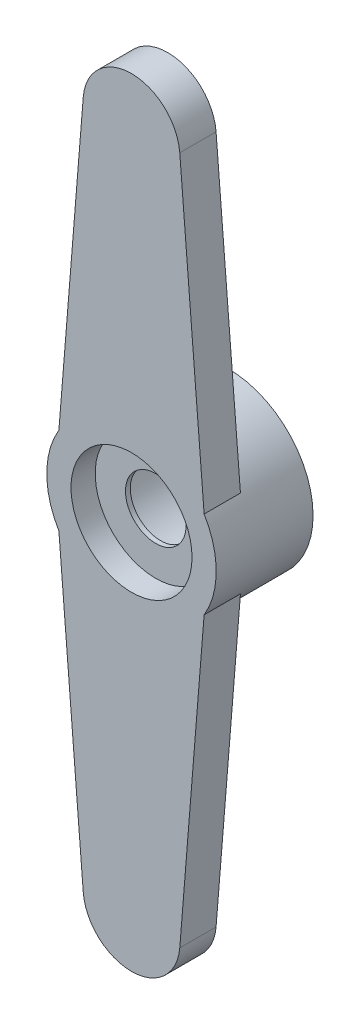
ISO-10303-21;
HEADER;
FILE_DESCRIPTION(('STEP AP214'),'2;1');
FILE_NAME('part.step','',(''),(''),'','','');
FILE_SCHEMA(('AUTOMOTIVE_DESIGN { 1 0 10303 214 1 1 1 1 }'));
ENDSEC;
DATA;
#1=APPLICATION_CONTEXT('core data for automotive mechanical design processes');
#2=APPLICATION_PROTOCOL_DEFINITION('international standard','automotive_design',2000,#1);
#3=PRODUCT_CONTEXT('',#1,'mechanical');
#4=PRODUCT('Part','Part','',(#3));
#5=PRODUCT_RELATED_PRODUCT_CATEGORY('part','',(#4));
#6=PRODUCT_DEFINITION_FORMATION('','',#4);
#7=PRODUCT_DEFINITION_CONTEXT('part definition',#1,'design');
#8=PRODUCT_DEFINITION('design','',#6,#7);
#9=PRODUCT_DEFINITION_SHAPE('','',#8);
#10=(LENGTH_UNIT() NAMED_UNIT(*) SI_UNIT(.MILLI.,.METRE.));
#11=(NAMED_UNIT(*) PLANE_ANGLE_UNIT() SI_UNIT($,.RADIAN.));
#12=(NAMED_UNIT(*) SI_UNIT($,.STERADIAN.) SOLID_ANGLE_UNIT());
#13=UNCERTAINTY_MEASURE_WITH_UNIT(LENGTH_MEASURE(1.E-05),#10,'distance_accuracy_value','');
#14=(GEOMETRIC_REPRESENTATION_CONTEXT(3) GLOBAL_UNCERTAINTY_ASSIGNED_CONTEXT((#13)) GLOBAL_UNIT_ASSIGNED_CONTEXT((#10,
#11,#12)) REPRESENTATION_CONTEXT('',''));
#15=CARTESIAN_POINT('',(0.,0.,0.));
#16=DIRECTION('',(0.,0.,1.));
#17=DIRECTION('',(1.,0.,0.));
#18=AXIS2_PLACEMENT_3D('',#15,#16,#17);
#19=CARTESIAN_POINT('',(0.,0.,2.8));
#20=DIRECTION('',(0.,0.,-1.));
#21=DIRECTION('',(-1.,0.,0.));
#22=AXIS2_PLACEMENT_3D('',#19,#20,#21);
#23=CYLINDRICAL_SURFACE('',#22,3.5);
#24=CARTESIAN_POINT('',(0.,0.,0.));
#25=DIRECTION('',(0.,0.,1.));
#26=DIRECTION('',(1.,0.,0.));
#27=AXIS2_PLACEMENT_3D('',#24,#25,#26);
#28=CIRCLE('',#27,3.5);
#29=CARTESIAN_POINT('',(3.5,0.,0.));
#30=VERTEX_POINT('',#29);
#31=EDGE_CURVE('E11',#30,#30,#28,.T.);
#32=ORIENTED_EDGE('',*,*,#31,.T.);
#33=EDGE_LOOP('',(#32));
#34=FACE_BOUND('',#33,.T.);
#35=DIRECTION('',(0.,0.,1.));
#36=VECTOR('',#35,1.);
#37=CARTESIAN_POINT('',(-3.,1.80277563773199,2.5));
#38=LINE('',#37,#36);
#39=CARTESIAN_POINT('',(-3.,1.80277563773199,2.5));
#40=VERTEX_POINT('',#39);
#41=CARTESIAN_POINT('',(-3.,1.80277563773199,4.));
#42=VERTEX_POINT('',#41);
#43=EDGE_CURVE('E54',#40,#42,#38,.T.);
#44=ORIENTED_EDGE('',*,*,#43,.F.);
#45=CARTESIAN_POINT('',(0.,0.,2.5));
#46=DIRECTION('',(0.,0.,1.));
#47=DIRECTION('',(1.,0.,0.));
#48=AXIS2_PLACEMENT_3D('',#45,#46,#47);
#49=CIRCLE('',#48,3.5);
#50=CARTESIAN_POINT('',(3.,1.80277563773199,2.5));
#51=VERTEX_POINT('',#50);
#52=EDGE_CURVE('E110',#51,#40,#49,.T.);
#53=ORIENTED_EDGE('',*,*,#52,.F.);
#54=DIRECTION('',(0.,0.,1.));
#55=VECTOR('',#54,1.);
#56=CARTESIAN_POINT('',(3.,1.80277563773199,2.5));
#57=LINE('',#56,#55);
#58=CARTESIAN_POINT('',(3.,1.80277563773199,4.));
#59=VERTEX_POINT('',#58);
#60=EDGE_CURVE('E119',#51,#59,#57,.T.);
#61=ORIENTED_EDGE('',*,*,#60,.T.);
#62=CARTESIAN_POINT('',(0.,0.,4.));
#63=DIRECTION('',(0.,0.,1.));
#64=DIRECTION('',(1.,0.,0.));
#65=AXIS2_PLACEMENT_3D('',#62,#63,#64);
#66=CIRCLE('',#65,3.5);
#67=CARTESIAN_POINT('',(3.,-1.80277563773199,4.));
#68=VERTEX_POINT('',#67);
#69=EDGE_CURVE('E200',#68,#59,#66,.T.);
#70=ORIENTED_EDGE('',*,*,#69,.F.);
#71=DIRECTION('',(0.,0.,1.));
#72=VECTOR('',#71,1.);
#73=CARTESIAN_POINT('',(3.,-1.80277563773199,2.5));
#74=LINE('',#73,#72);
#75=CARTESIAN_POINT('',(3.,-1.80277563773199,2.5));
#76=VERTEX_POINT('',#75);
#77=EDGE_CURVE('E179',#76,#68,#74,.T.);
#78=ORIENTED_EDGE('',*,*,#77,.F.);
#79=CARTESIAN_POINT('',(0.,0.,2.5));
#80=DIRECTION('',(0.,0.,-1.));
#81=DIRECTION('',(1.,0.,0.));
#82=AXIS2_PLACEMENT_3D('',#79,#80,#81);
#83=CIRCLE('',#82,3.5);
#84=CARTESIAN_POINT('',(-3.,-1.80277563773199,2.5));
#85=VERTEX_POINT('',#84);
#86=EDGE_CURVE('E154',#76,#85,#83,.T.);
#87=ORIENTED_EDGE('',*,*,#86,.T.);
#88=DIRECTION('',(0.,0.,1.));
#89=VECTOR('',#88,1.);
#90=CARTESIAN_POINT('',(-3.,-1.80277563773199,2.5));
#91=LINE('',#90,#89);
#92=CARTESIAN_POINT('',(-3.,-1.80277563773199,4.));
#93=VERTEX_POINT('',#92);
#94=EDGE_CURVE('E170',#85,#93,#91,.T.);
#95=ORIENTED_EDGE('',*,*,#94,.T.);
#96=EDGE_CURVE('E196',#42,#93,#66,.T.);
#97=ORIENTED_EDGE('',*,*,#96,.F.);
#98=EDGE_LOOP('',(#44,#53,#61,#70,#78,#87,#95,#97));
#99=FACE_BOUND('',#98,.T.);
#100=ADVANCED_FACE('F39',(#34,#99),#23,.T.);
#101=CARTESIAN_POINT('',(0.,0.,3.));
#102=DIRECTION('',(0.,0.,1.));
#103=DIRECTION('',(1.,0.,0.));
#104=AXIS2_PLACEMENT_3D('',#101,#102,#103);
#105=PLANE('',#104);
#106=CARTESIAN_POINT('',(0.,0.,3.));
#107=DIRECTION('',(0.,0.,1.));
#108=DIRECTION('',(1.,0.,0.));
#109=AXIS2_PLACEMENT_3D('',#106,#107,#108);
#110=CIRCLE('',#109,1.25);
#111=CARTESIAN_POINT('',(1.25,0.,3.));
#112=VERTEX_POINT('',#111);
#113=EDGE_CURVE('E204',#112,#112,#110,.T.);
#114=ORIENTED_EDGE('',*,*,#113,.F.);
#115=EDGE_LOOP('',(#114));
#116=FACE_BOUND('',#115,.T.);
#117=CARTESIAN_POINT('',(0.,0.,3.));
#118=DIRECTION('',(0.,0.,1.));
#119=DIRECTION('',(1.,0.,0.));
#120=AXIS2_PLACEMENT_3D('',#117,#118,#119);
#121=CIRCLE('',#120,2.5);
#122=CARTESIAN_POINT('',(2.5,0.,3.));
#123=VERTEX_POINT('',#122);
#124=EDGE_CURVE('E182',#123,#123,#121,.T.);
#125=ORIENTED_EDGE('',*,*,#124,.T.);
#126=EDGE_LOOP('',(#125));
#127=FACE_BOUND('',#126,.T.);
#128=ADVANCED_FACE('F232',(#116,#127),#105,.T.);
#129=CARTESIAN_POINT('',(0.,0.,0.));
#130=DIRECTION('',(0.,0.,1.));
#131=DIRECTION('',(1.,0.,0.));
#132=AXIS2_PLACEMENT_3D('',#129,#130,#131);
#133=PLANE('',#132);
#134=ORIENTED_EDGE('',*,*,#31,.F.);
#135=EDGE_LOOP('',(#134));
#136=FACE_BOUND('',#135,.T.);
#137=CARTESIAN_POINT('',(0.,0.,0.));
#138=DIRECTION('',(0.,0.,1.));
#139=DIRECTION('',(1.,0.,0.));
#140=AXIS2_PLACEMENT_3D('',#137,#138,#139);
#141=CIRCLE('',#140,2.5);
#142=CARTESIAN_POINT('',(2.5,0.,0.));
#143=VERTEX_POINT('',#142);
#144=EDGE_CURVE('E47',#143,#143,#141,.T.);
#145=ORIENTED_EDGE('',*,*,#144,.T.);
#146=EDGE_LOOP('',(#145));
#147=FACE_BOUND('',#146,.T.);
#148=ADVANCED_FACE('F218',(#136,#147),#133,.F.);
#149=CARTESIAN_POINT('',(0.,0.,2.8));
#150=DIRECTION('',(0.,0.,-1.));
#151=DIRECTION('',(-1.,0.,0.));
#152=AXIS2_PLACEMENT_3D('',#149,#150,#151);
#153=CYLINDRICAL_SURFACE('',#152,2.5);
#154=CARTESIAN_POINT('',(0.,0.,2.8));
#155=DIRECTION('',(0.,0.,1.));
#156=DIRECTION('',(1.,0.,0.));
#157=AXIS2_PLACEMENT_3D('',#154,#155,#156);
#158=CIRCLE('',#157,2.5);
#159=CARTESIAN_POINT('',(2.5,0.,2.8));
#160=VERTEX_POINT('',#159);
#161=EDGE_CURVE('E208',#160,#160,#158,.T.);
#162=ORIENTED_EDGE('',*,*,#161,.T.);
#163=EDGE_LOOP('',(#162));
#164=FACE_BOUND('',#163,.T.);
#165=ORIENTED_EDGE('',*,*,#144,.F.);
#166=EDGE_LOOP('',(#165));
#167=FACE_BOUND('',#166,.T.);
#168=ADVANCED_FACE('F220',(#164,#167),#153,.F.);
#169=CARTESIAN_POINT('',(0.,0.,2.8));
#170=DIRECTION('',(0.,0.,1.));
#171=DIRECTION('',(1.,0.,0.));
#172=AXIS2_PLACEMENT_3D('',#169,#170,#171);
#173=PLANE('',#172);
#174=CARTESIAN_POINT('',(0.,0.,2.8));
#175=DIRECTION('',(0.,0.,1.));
#176=DIRECTION('',(1.,0.,0.));
#177=AXIS2_PLACEMENT_3D('',#174,#175,#176);
#178=CIRCLE('',#177,1.25);
#179=CARTESIAN_POINT('',(1.25,0.,2.8));
#180=VERTEX_POINT('',#179);
#181=EDGE_CURVE('E203',#180,#180,#178,.T.);
#182=ORIENTED_EDGE('',*,*,#181,.T.);
#183=EDGE_LOOP('',(#182));
#184=FACE_BOUND('',#183,.T.);
#185=ORIENTED_EDGE('',*,*,#161,.F.);
#186=EDGE_LOOP('',(#185));
#187=FACE_BOUND('',#186,.T.);
#188=ADVANCED_FACE('F222',(#184,#187),#173,.F.);
#189=CARTESIAN_POINT('',(0.,0.,3.));
#190=DIRECTION('',(0.,0.,-1.));
#191=DIRECTION('',(-1.,0.,0.));
#192=AXIS2_PLACEMENT_3D('',#189,#190,#191);
#193=CYLINDRICAL_SURFACE('',#192,1.25);
#194=ORIENTED_EDGE('',*,*,#113,.T.);
#195=EDGE_LOOP('',(#194));
#196=FACE_BOUND('',#195,.T.);
#197=ORIENTED_EDGE('',*,*,#181,.F.);
#198=EDGE_LOOP('',(#197));
#199=FACE_BOUND('',#198,.T.);
#200=ADVANCED_FACE('F229',(#196,#199),#193,.F.);
#201=CARTESIAN_POINT('',(0.,0.,4.));
#202=DIRECTION('',(0.,0.,1.));
#203=DIRECTION('',(1.,0.,0.));
#204=AXIS2_PLACEMENT_3D('',#201,#202,#203);
#205=PLANE('',#204);
#206=ORIENTED_EDGE('',*,*,#69,.T.);
#207=DIRECTION('',(0.0807729702992028,-0.99673252543952,0.));
#208=VECTOR('',#207,1.);
#209=CARTESIAN_POINT('',(3.,1.80277563773199,4.));
#210=LINE('',#209,#208);
#211=CARTESIAN_POINT('',(1.99346505087904,14.2233430387351,4.));
#212=VERTEX_POINT('',#211);
#213=EDGE_CURVE('E122',#212,#59,#210,.T.);
#214=ORIENTED_EDGE('',*,*,#213,.F.);
#215=CARTESIAN_POINT('',(0.,14.0617970981367,4.));
#216=DIRECTION('',(0.,0.,-1.));
#217=DIRECTION('',(1.,0.,0.));
#218=AXIS2_PLACEMENT_3D('',#215,#216,#217);
#219=CIRCLE('',#218,2.);
#220=CARTESIAN_POINT('',(-1.99346505087904,14.2233430387351,4.));
#221=VERTEX_POINT('',#220);
#222=EDGE_CURVE('E134',#221,#212,#219,.T.);
#223=ORIENTED_EDGE('',*,*,#222,.F.);
#224=DIRECTION('',(0.0807729702992028,0.99673252543952,0.));
#225=VECTOR('',#224,1.);
#226=CARTESIAN_POINT('',(-3.,1.80277563773199,4.));
#227=LINE('',#226,#225);
#228=EDGE_CURVE('E131',#42,#221,#227,.T.);
#229=ORIENTED_EDGE('',*,*,#228,.F.);
#230=ORIENTED_EDGE('',*,*,#96,.T.);
#231=DIRECTION('',(0.0807729702992028,-0.99673252543952,0.));
#232=VECTOR('',#231,1.);
#233=CARTESIAN_POINT('',(-3.,-1.80277563773199,4.));
#234=LINE('',#233,#232);
#235=CARTESIAN_POINT('',(-1.99346505087904,-14.2233430387351,4.));
#236=VERTEX_POINT('',#235);
#237=EDGE_CURVE('E147',#93,#236,#234,.T.);
#238=ORIENTED_EDGE('',*,*,#237,.T.);
#239=CARTESIAN_POINT('',(0.,-14.0617970981367,4.));
#240=DIRECTION('',(0.,0.,1.));
#241=DIRECTION('',(1.,0.,0.));
#242=AXIS2_PLACEMENT_3D('',#239,#240,#241);
#243=CIRCLE('',#242,2.);
#244=CARTESIAN_POINT('',(1.99346505087904,-14.2233430387351,4.));
#245=VERTEX_POINT('',#244);
#246=EDGE_CURVE('E174',#236,#245,#243,.T.);
#247=ORIENTED_EDGE('',*,*,#246,.T.);
#248=DIRECTION('',(0.0807729702992028,0.99673252543952,0.));
#249=VECTOR('',#248,1.);
#250=CARTESIAN_POINT('',(3.,-1.80277563773199,4.));
#251=LINE('',#250,#249);
#252=EDGE_CURVE('E62',#245,#68,#251,.T.);
#253=ORIENTED_EDGE('',*,*,#252,.T.);
#254=EDGE_LOOP('',(#206,#214,#223,#229,#230,#238,#247,#253));
#255=FACE_BOUND('',#254,.T.);
#256=CARTESIAN_POINT('',(0.,0.,4.));
#257=DIRECTION('',(0.,0.,1.));
#258=DIRECTION('',(1.,0.,0.));
#259=AXIS2_PLACEMENT_3D('',#256,#257,#258);
#260=CIRCLE('',#259,2.5);
#261=CARTESIAN_POINT('',(2.5,0.,4.));
#262=VERTEX_POINT('',#261);
#263=EDGE_CURVE('E192',#262,#262,#260,.T.);
#264=ORIENTED_EDGE('',*,*,#263,.F.);
#265=EDGE_LOOP('',(#264));
#266=FACE_BOUND('',#265,.T.);
#267=ADVANCED_FACE('F251',(#255,#266),#205,.T.);
#268=CARTESIAN_POINT('',(0.,0.,4.));
#269=DIRECTION('',(0.,0.,-1.));
#270=DIRECTION('',(-1.,0.,0.));
#271=AXIS2_PLACEMENT_3D('',#268,#269,#270);
#272=CYLINDRICAL_SURFACE('',#271,2.5);
#273=ORIENTED_EDGE('',*,*,#263,.T.);
#274=EDGE_LOOP('',(#273));
#275=FACE_BOUND('',#274,.T.);
#276=ORIENTED_EDGE('',*,*,#124,.F.);
#277=EDGE_LOOP('',(#276));
#278=FACE_BOUND('',#277,.T.);
#279=ADVANCED_FACE('F255',(#275,#278),#272,.F.);
#280=CARTESIAN_POINT('',(3.,-1.80277563773199,2.5));
#281=DIRECTION('',(0.99673252543952,-0.0807729702992027,0.));
#282=DIRECTION('',(0.0807729702992028,0.996732525439521,0.));
#283=AXIS2_PLACEMENT_3D('',#280,#281,#282);
#284=PLANE('',#283);
#285=ORIENTED_EDGE('',*,*,#252,.F.);
#286=DIRECTION('',(0.,0.,1.));
#287=VECTOR('',#286,1.);
#288=CARTESIAN_POINT('',(1.99346505087904,-14.2233430387351,2.5));
#289=LINE('',#288,#287);
#290=CARTESIAN_POINT('',(1.99346505087904,-14.2233430387351,2.5));
#291=VERTEX_POINT('',#290);
#292=EDGE_CURVE('E183',#291,#245,#289,.T.);
#293=ORIENTED_EDGE('',*,*,#292,.F.);
#294=DIRECTION('',(0.0807729702992028,0.99673252543952,0.));
#295=VECTOR('',#294,1.);
#296=CARTESIAN_POINT('',(3.,-1.80277563773199,2.5));
#297=LINE('',#296,#295);
#298=EDGE_CURVE('E166',#291,#76,#297,.T.);
#299=ORIENTED_EDGE('',*,*,#298,.T.);
#300=ORIENTED_EDGE('',*,*,#77,.T.);
#301=EDGE_LOOP('',(#285,#293,#299,#300));
#302=FACE_BOUND('',#301,.T.);
#303=ADVANCED_FACE('F258',(#302),#284,.T.);
#304=CARTESIAN_POINT('',(0.,-14.0617970981367,2.5));
#305=DIRECTION('',(0.,0.,1.));
#306=DIRECTION('',(1.,0.,0.));
#307=AXIS2_PLACEMENT_3D('',#304,#305,#306);
#308=CYLINDRICAL_SURFACE('',#307,2.);
#309=ORIENTED_EDGE('',*,*,#246,.F.);
#310=DIRECTION('',(0.,0.,1.));
#311=VECTOR('',#310,1.);
#312=CARTESIAN_POINT('',(-1.99346505087904,-14.2233430387351,2.5));
#313=LINE('',#312,#311);
#314=CARTESIAN_POINT('',(-1.99346505087904,-14.2233430387351,2.5));
#315=VERTEX_POINT('',#314);
#316=EDGE_CURVE('E186',#315,#236,#313,.T.);
#317=ORIENTED_EDGE('',*,*,#316,.F.);
#318=CARTESIAN_POINT('',(0.,-14.0617970981367,2.5));
#319=DIRECTION('',(0.,0.,1.));
#320=DIRECTION('',(1.,0.,0.));
#321=AXIS2_PLACEMENT_3D('',#318,#319,#320);
#322=CIRCLE('',#321,2.);
#323=EDGE_CURVE('E162',#315,#291,#322,.T.);
#324=ORIENTED_EDGE('',*,*,#323,.T.);
#325=ORIENTED_EDGE('',*,*,#292,.T.);
#326=EDGE_LOOP('',(#309,#317,#324,#325));
#327=FACE_BOUND('',#326,.T.);
#328=ADVANCED_FACE('F264',(#327),#308,.T.);
#329=CARTESIAN_POINT('',(-3.,-1.80277563773199,2.5));
#330=DIRECTION('',(-0.99673252543952,-0.0807729702992027,0.));
#331=DIRECTION('',(0.0807729702992028,-0.996732525439521,0.));
#332=AXIS2_PLACEMENT_3D('',#329,#330,#331);
#333=PLANE('',#332);
#334=ORIENTED_EDGE('',*,*,#237,.F.);
#335=ORIENTED_EDGE('',*,*,#94,.F.);
#336=DIRECTION('',(0.0807729702992028,-0.99673252543952,0.));
#337=VECTOR('',#336,1.);
#338=CARTESIAN_POINT('',(-3.,-1.80277563773199,2.5));
#339=LINE('',#338,#337);
#340=EDGE_CURVE('E158',#85,#315,#339,.T.);
#341=ORIENTED_EDGE('',*,*,#340,.T.);
#342=ORIENTED_EDGE('',*,*,#316,.T.);
#343=EDGE_LOOP('',(#334,#335,#341,#342));
#344=FACE_BOUND('',#343,.T.);
#345=ADVANCED_FACE('F260',(#344),#333,.T.);
#346=CARTESIAN_POINT('',(0.,0.,2.5));
#347=DIRECTION('',(0.,0.,1.));
#348=DIRECTION('',(1.,0.,0.));
#349=AXIS2_PLACEMENT_3D('',#346,#347,#348);
#350=PLANE('',#349);
#351=ORIENTED_EDGE('',*,*,#86,.F.);
#352=ORIENTED_EDGE('',*,*,#298,.F.);
#353=ORIENTED_EDGE('',*,*,#323,.F.);
#354=ORIENTED_EDGE('',*,*,#340,.F.);
#355=EDGE_LOOP('',(#351,#352,#353,#354));
#356=FACE_BOUND('',#355,.T.);
#357=ADVANCED_FACE('F263',(#356),#350,.F.);
#358=CARTESIAN_POINT('',(-3.,1.80277563773199,2.5));
#359=DIRECTION('',(0.99673252543952,-0.0807729702992027,0.));
#360=DIRECTION('',(0.0807729702992028,0.996732525439521,0.));
#361=AXIS2_PLACEMENT_3D('',#358,#359,#360);
#362=PLANE('',#361);
#363=ORIENTED_EDGE('',*,*,#228,.T.);
#364=DIRECTION('',(0.,0.,1.));
#365=VECTOR('',#364,1.);
#366=CARTESIAN_POINT('',(-1.99346505087904,14.2233430387351,2.5));
#367=LINE('',#366,#365);
#368=CARTESIAN_POINT('',(-1.99346505087904,14.2233430387351,2.5));
#369=VERTEX_POINT('',#368);
#370=EDGE_CURVE('E148',#369,#221,#367,.T.);
#371=ORIENTED_EDGE('',*,*,#370,.F.);
#372=DIRECTION('',(0.0807729702992028,0.99673252543952,0.));
#373=VECTOR('',#372,1.);
#374=CARTESIAN_POINT('',(-3.,1.80277563773199,2.5));
#375=LINE('',#374,#373);
#376=EDGE_CURVE('E127',#40,#369,#375,.T.);
#377=ORIENTED_EDGE('',*,*,#376,.F.);
#378=ORIENTED_EDGE('',*,*,#43,.T.);
#379=EDGE_LOOP('',(#363,#371,#377,#378));
#380=FACE_BOUND('',#379,.T.);
#381=ADVANCED_FACE('F274',(#380),#362,.F.);
#382=CARTESIAN_POINT('',(0.,14.0617970981367,2.5));
#383=DIRECTION('',(0.,0.,1.));
#384=DIRECTION('',(1.,0.,0.));
#385=AXIS2_PLACEMENT_3D('',#382,#383,#384);
#386=CYLINDRICAL_SURFACE('',#385,2.);
#387=ORIENTED_EDGE('',*,*,#222,.T.);
#388=DIRECTION('',(0.,0.,1.));
#389=VECTOR('',#388,1.);
#390=CARTESIAN_POINT('',(1.99346505087904,14.2233430387351,2.5));
#391=LINE('',#390,#389);
#392=CARTESIAN_POINT('',(1.99346505087904,14.2233430387351,2.5));
#393=VERTEX_POINT('',#392);
#394=EDGE_CURVE('E126',#393,#212,#391,.T.);
#395=ORIENTED_EDGE('',*,*,#394,.F.);
#396=CARTESIAN_POINT('',(0.,14.0617970981367,2.5));
#397=DIRECTION('',(0.,0.,-1.));
#398=DIRECTION('',(1.,0.,0.));
#399=AXIS2_PLACEMENT_3D('',#396,#397,#398);
#400=CIRCLE('',#399,2.);
#401=EDGE_CURVE('E112',#369,#393,#400,.T.);
#402=ORIENTED_EDGE('',*,*,#401,.F.);
#403=ORIENTED_EDGE('',*,*,#370,.T.);
#404=EDGE_LOOP('',(#387,#395,#402,#403));
#405=FACE_BOUND('',#404,.T.);
#406=ADVANCED_FACE('F278',(#405),#386,.T.);
#407=CARTESIAN_POINT('',(3.,1.80277563773199,2.5));
#408=DIRECTION('',(-0.99673252543952,-0.0807729702992027,0.));
#409=DIRECTION('',(0.0807729702992028,-0.996732525439521,0.));
#410=AXIS2_PLACEMENT_3D('',#407,#408,#409);
#411=PLANE('',#410);
#412=ORIENTED_EDGE('',*,*,#213,.T.);
#413=ORIENTED_EDGE('',*,*,#60,.F.);
#414=DIRECTION('',(0.0807729702992028,-0.99673252543952,0.));
#415=VECTOR('',#414,1.);
#416=CARTESIAN_POINT('',(3.,1.80277563773199,2.5));
#417=LINE('',#416,#415);
#418=EDGE_CURVE('E106',#393,#51,#417,.T.);
#419=ORIENTED_EDGE('',*,*,#418,.F.);
#420=ORIENTED_EDGE('',*,*,#394,.T.);
#421=EDGE_LOOP('',(#412,#413,#419,#420));
#422=FACE_BOUND('',#421,.T.);
#423=ADVANCED_FACE('F120',(#422),#411,.F.);
#424=CARTESIAN_POINT('',(0.,0.,2.5));
#425=DIRECTION('',(0.,0.,1.));
#426=DIRECTION('',(1.,0.,0.));
#427=AXIS2_PLACEMENT_3D('',#424,#425,#426);
#428=PLANE('',#427);
#429=ORIENTED_EDGE('',*,*,#52,.T.);
#430=ORIENTED_EDGE('',*,*,#376,.T.);
#431=ORIENTED_EDGE('',*,*,#401,.T.);
#432=ORIENTED_EDGE('',*,*,#418,.T.);
#433=EDGE_LOOP('',(#429,#430,#431,#432));
#434=FACE_BOUND('',#433,.T.);
#435=ADVANCED_FACE('F108',(#434),#428,.F.);
#436=CLOSED_SHELL('',(#100,#128,#148,#168,#188,#200,#267,#279,#303,#328,#345,#357,#381,#406,
#423,#435));
#437=MANIFOLD_SOLID_BREP('B2',#436);
#438=ADVANCED_BREP_SHAPE_REPRESENTATION('',(#18,#437),#14);
#439=SHAPE_DEFINITION_REPRESENTATION(#9,#438);
ENDSEC;
END-ISO-10303-21;
